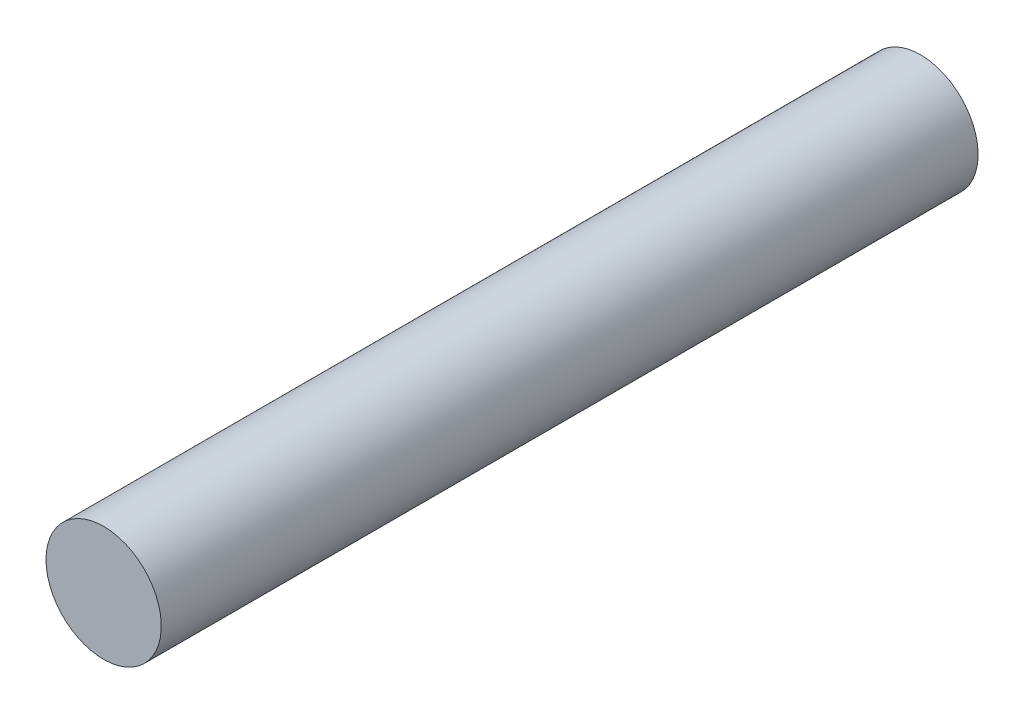
ISO-10303-21;
HEADER;
FILE_DESCRIPTION(('STEP AP214'),'2;1');
FILE_NAME('part.step','',(''),(''),'','','');
FILE_SCHEMA(('AUTOMOTIVE_DESIGN { 1 0 10303 214 1 1 1 1 }'));
ENDSEC;
DATA;
#1=APPLICATION_CONTEXT('core data for automotive mechanical design processes');
#2=APPLICATION_PROTOCOL_DEFINITION('international standard','automotive_design',2000,#1);
#3=PRODUCT_CONTEXT('',#1,'mechanical');
#4=PRODUCT('Part','Part','',(#3));
#5=PRODUCT_RELATED_PRODUCT_CATEGORY('part','',(#4));
#6=PRODUCT_DEFINITION_FORMATION('','',#4);
#7=PRODUCT_DEFINITION_CONTEXT('part definition',#1,'design');
#8=PRODUCT_DEFINITION('design','',#6,#7);
#9=PRODUCT_DEFINITION_SHAPE('','',#8);
#10=(LENGTH_UNIT() NAMED_UNIT(*) SI_UNIT(.MILLI.,.METRE.));
#11=(NAMED_UNIT(*) PLANE_ANGLE_UNIT() SI_UNIT($,.RADIAN.));
#12=(NAMED_UNIT(*) SI_UNIT($,.STERADIAN.) SOLID_ANGLE_UNIT());
#13=UNCERTAINTY_MEASURE_WITH_UNIT(LENGTH_MEASURE(1.E-05),#10,'distance_accuracy_value','');
#14=(GEOMETRIC_REPRESENTATION_CONTEXT(3) GLOBAL_UNCERTAINTY_ASSIGNED_CONTEXT((#13)) GLOBAL_UNIT_ASSIGNED_CONTEXT((#10,
#11,#12)) REPRESENTATION_CONTEXT('',''));
#15=CARTESIAN_POINT('',(0.,0.,0.));
#16=DIRECTION('',(0.,0.,1.));
#17=DIRECTION('',(1.,0.,0.));
#18=AXIS2_PLACEMENT_3D('',#15,#16,#17);
#19=CARTESIAN_POINT('',(0.,0.,180.));
#20=DIRECTION('',(0.,0.,-1.));
#21=DIRECTION('',(-1.,0.,0.));
#22=AXIS2_PLACEMENT_3D('',#19,#20,#21);
#23=CYLINDRICAL_SURFACE('',#22,12.7);
#24=CARTESIAN_POINT('',(0.,0.,180.));
#25=DIRECTION('',(0.,0.,1.));
#26=DIRECTION('',(1.,0.,0.));
#27=AXIS2_PLACEMENT_3D('',#24,#25,#26);
#28=CIRCLE('',#27,12.7);
#29=CARTESIAN_POINT('',(-12.7,0.,180.));
#30=VERTEX_POINT('',#29);
#31=EDGE_CURVE('E10',#30,#30,#28,.T.);
#32=CARTESIAN_POINT('',(0.,0.,0.));
#33=DIRECTION('',(0.,0.,1.));
#34=DIRECTION('',(1.,0.,0.));
#35=AXIS2_PLACEMENT_3D('',#32,#33,#34);
#36=CIRCLE('',#35,12.7);
#37=CARTESIAN_POINT('',(-12.7,0.,0.));
#38=VERTEX_POINT('',#37);
#39=EDGE_CURVE('E40',#38,#38,#36,.T.);
#40=CARTESIAN_POINT('',(-12.7,0.,180.));
#41=CARTESIAN_POINT('',(-12.7,0.,178.125));
#42=CARTESIAN_POINT('',(-12.7,0.,176.25));
#43=CARTESIAN_POINT('',(-12.7,0.,172.5));
#44=CARTESIAN_POINT('',(-12.7,0.,170.625));
#45=CARTESIAN_POINT('',(-12.7,0.,166.875));
#46=CARTESIAN_POINT('',(-12.7,0.,165.));
#47=CARTESIAN_POINT('',(-12.7,0.,161.25));
#48=CARTESIAN_POINT('',(-12.7,0.,159.375));
#49=CARTESIAN_POINT('',(-12.7,0.,155.625));
#50=CARTESIAN_POINT('',(-12.7,0.,153.75));
#51=CARTESIAN_POINT('',(-12.7,0.,150.));
#52=CARTESIAN_POINT('',(-12.7,0.,148.125));
#53=CARTESIAN_POINT('',(-12.7,0.,144.375));
#54=CARTESIAN_POINT('',(-12.7,0.,142.5));
#55=CARTESIAN_POINT('',(-12.7,0.,138.75));
#56=CARTESIAN_POINT('',(-12.7,0.,136.875));
#57=CARTESIAN_POINT('',(-12.7,0.,133.125));
#58=CARTESIAN_POINT('',(-12.7,0.,131.25));
#59=CARTESIAN_POINT('',(-12.7,0.,127.5));
#60=CARTESIAN_POINT('',(-12.7,0.,125.625));
#61=CARTESIAN_POINT('',(-12.7,0.,121.875));
#62=CARTESIAN_POINT('',(-12.7,0.,120.));
#63=CARTESIAN_POINT('',(-12.7,0.,116.25));
#64=CARTESIAN_POINT('',(-12.7,0.,114.375));
#65=CARTESIAN_POINT('',(-12.7,0.,110.625));
#66=CARTESIAN_POINT('',(-12.7,0.,108.75));
#67=CARTESIAN_POINT('',(-12.7,0.,105.));
#68=CARTESIAN_POINT('',(-12.7,0.,103.125));
#69=CARTESIAN_POINT('',(-12.7,0.,99.375));
#70=CARTESIAN_POINT('',(-12.7,0.,97.5));
#71=CARTESIAN_POINT('',(-12.7,0.,93.75));
#72=CARTESIAN_POINT('',(-12.7,0.,91.875));
#73=CARTESIAN_POINT('',(-12.7,0.,88.125));
#74=CARTESIAN_POINT('',(-12.7,0.,86.25));
#75=CARTESIAN_POINT('',(-12.7,0.,82.5));
#76=CARTESIAN_POINT('',(-12.7,0.,80.625));
#77=CARTESIAN_POINT('',(-12.7,0.,76.875));
#78=CARTESIAN_POINT('',(-12.7,0.,75.));
#79=CARTESIAN_POINT('',(-12.7,0.,71.25));
#80=CARTESIAN_POINT('',(-12.7,0.,69.375));
#81=CARTESIAN_POINT('',(-12.7,0.,65.625));
#82=CARTESIAN_POINT('',(-12.7,0.,63.75));
#83=CARTESIAN_POINT('',(-12.7,0.,60.));
#84=CARTESIAN_POINT('',(-12.7,0.,58.125));
#85=CARTESIAN_POINT('',(-12.7,0.,54.375));
#86=CARTESIAN_POINT('',(-12.7,0.,52.5));
#87=CARTESIAN_POINT('',(-12.7,0.,48.75));
#88=CARTESIAN_POINT('',(-12.7,0.,46.875));
#89=CARTESIAN_POINT('',(-12.7,0.,43.125));
#90=CARTESIAN_POINT('',(-12.7,0.,41.25));
#91=CARTESIAN_POINT('',(-12.7,0.,37.5));
#92=CARTESIAN_POINT('',(-12.7,0.,35.625));
#93=CARTESIAN_POINT('',(-12.7,0.,31.875));
#94=CARTESIAN_POINT('',(-12.7,0.,30.));
#95=CARTESIAN_POINT('',(-12.7,0.,26.25));
#96=CARTESIAN_POINT('',(-12.7,0.,24.375));
#97=CARTESIAN_POINT('',(-12.7,0.,20.625));
#98=CARTESIAN_POINT('',(-12.7,0.,18.75));
#99=CARTESIAN_POINT('',(-12.7,0.,15.));
#100=CARTESIAN_POINT('',(-12.7,0.,13.125));
#101=CARTESIAN_POINT('',(-12.7,0.,9.37499999999998));
#102=CARTESIAN_POINT('',(-12.7,0.,7.49999999999997));
#103=CARTESIAN_POINT('',(-12.7,0.,3.74999999999997));
#104=CARTESIAN_POINT('',(-12.7,0.,1.87499999999997));
#105=CARTESIAN_POINT('',(-12.7,0.,0.));
#106=B_SPLINE_CURVE_WITH_KNOTS('',3,(#40,#41,#42,#43,#44,#45,#46,#47,#48,#49,#50,#51,#52,#53,
#54,#55,#56,#57,#58,#59,#60,#61,#62,#63,#64,#65,#66,#67,#68,#69,#70,#71,#72,#73,#74,#75,#76,#77,
#78,#79,#80,#81,#82,#83,#84,#85,#86,#87,#88,#89,#90,#91,#92,#93,#94,#95,#96,#97,#98,#99,#100,
#101,#102,#103,#104,#105),.UNSPECIFIED.,.F.,.F.,(4,2,2,2,2,2,2,2,2,2,2,2,2,2,2,2,2,2,2,2,2,2,2,
2,2,2,2,2,2,2,2,2,4),(0.,5.62499999999999,11.25,16.875,22.5,28.125,33.75,39.375,45.,50.625,
56.25,61.875,67.5,73.125,78.75,84.375,90.,95.625,101.25,106.875,112.5,118.125,123.75,129.375,
135.,140.625,146.25,151.875,157.5,163.125,168.75,174.375,180.),.UNSPECIFIED.);
#107=EDGE_CURVE('BSEAM37',#30,#38,#106,.T.);
#108=ORIENTED_EDGE('',*,*,#31,.F.);
#109=ORIENTED_EDGE('',*,*,#39,.T.);
#110=ORIENTED_EDGE('',*,*,#107,.T.);
#111=ORIENTED_EDGE('',*,*,#107,.F.);
#112=EDGE_LOOP('',(#108,#110,#109,#111));
#113=FACE_BOUND('',#112,.T.);
#114=ADVANCED_FACE('F37',(#113),#23,.T.);
#115=CARTESIAN_POINT('',(0.,0.,180.));
#116=DIRECTION('',(0.,0.,1.));
#117=DIRECTION('',(1.,0.,0.));
#118=AXIS2_PLACEMENT_3D('',#115,#116,#117);
#119=PLANE('',#118);
#120=ORIENTED_EDGE('',*,*,#31,.T.);
#121=EDGE_LOOP('',(#120));
#122=FACE_BOUND('',#121,.T.);
#123=ADVANCED_FACE('F52',(#122),#119,.T.);
#124=CARTESIAN_POINT('',(0.,0.,0.));
#125=DIRECTION('',(0.,0.,1.));
#126=DIRECTION('',(1.,0.,0.));
#127=AXIS2_PLACEMENT_3D('',#124,#125,#126);
#128=PLANE('',#127);
#129=ORIENTED_EDGE('',*,*,#39,.F.);
#130=EDGE_LOOP('',(#129));
#131=FACE_BOUND('',#130,.T.);
#132=ADVANCED_FACE('F50',(#131),#128,.F.);
#133=CLOSED_SHELL('',(#114,#123,#132));
#134=MANIFOLD_SOLID_BREP('B2',#133);
#135=ADVANCED_BREP_SHAPE_REPRESENTATION('',(#18,#134),#14);
#136=SHAPE_DEFINITION_REPRESENTATION(#9,#135);
ENDSEC;
END-ISO-10303-21;
